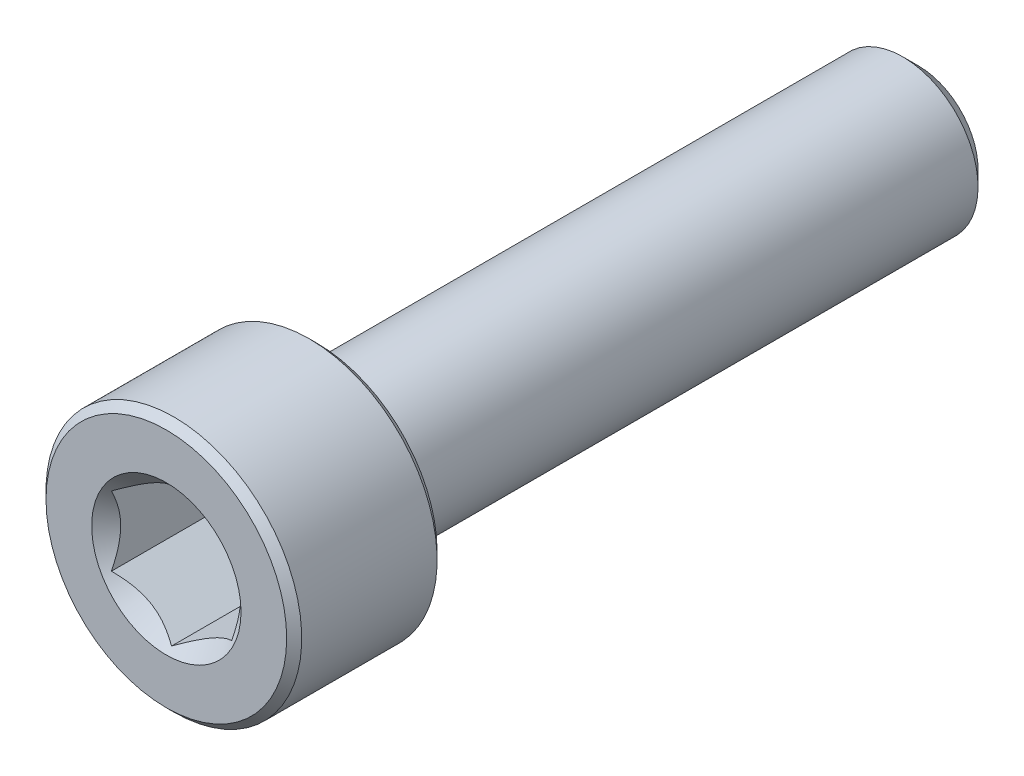
ISO-10303-21;
HEADER;
FILE_DESCRIPTION(('STEP AP214'),'2;1');
FILE_NAME('part.step','',(''),(''),'','','');
FILE_SCHEMA(('AUTOMOTIVE_DESIGN { 1 0 10303 214 1 1 1 1 }'));
ENDSEC;
DATA;
#1=APPLICATION_CONTEXT('core data for automotive mechanical design processes');
#2=APPLICATION_PROTOCOL_DEFINITION('international standard','automotive_design',2000,#1);
#3=PRODUCT_CONTEXT('',#1,'mechanical');
#4=PRODUCT('Part','Part','',(#3));
#5=PRODUCT_RELATED_PRODUCT_CATEGORY('part','',(#4));
#6=PRODUCT_DEFINITION_FORMATION('','',#4);
#7=PRODUCT_DEFINITION_CONTEXT('part definition',#1,'design');
#8=PRODUCT_DEFINITION('design','',#6,#7);
#9=PRODUCT_DEFINITION_SHAPE('','',#8);
#10=(LENGTH_UNIT() NAMED_UNIT(*) SI_UNIT(.MILLI.,.METRE.));
#11=(NAMED_UNIT(*) PLANE_ANGLE_UNIT() SI_UNIT($,.RADIAN.));
#12=(NAMED_UNIT(*) SI_UNIT($,.STERADIAN.) SOLID_ANGLE_UNIT());
#13=UNCERTAINTY_MEASURE_WITH_UNIT(LENGTH_MEASURE(1.E-05),#10,'distance_accuracy_value','');
#14=(GEOMETRIC_REPRESENTATION_CONTEXT(3) GLOBAL_UNCERTAINTY_ASSIGNED_CONTEXT((#13)) GLOBAL_UNIT_ASSIGNED_CONTEXT((#10,
#11,#12)) REPRESENTATION_CONTEXT('',''));
#15=CARTESIAN_POINT('',(0.,0.,0.));
#16=DIRECTION('',(0.,0.,1.));
#17=DIRECTION('',(1.,0.,0.));
#18=AXIS2_PLACEMENT_3D('',#15,#16,#17);
#19=CARTESIAN_POINT('',(0.,1.98038475772934,-12.5));
#20=DIRECTION('',(0.,0.,-1.));
#21=DIRECTION('',(0.,1.,0.));
#22=AXIS2_PLACEMENT_3D('',#19,#20,#21);
#23=PLANE('',#22);
#24=CARTESIAN_POINT('',(0.,0.,-12.5));
#25=DIRECTION('',(0.,0.,-1.));
#26=DIRECTION('',(0.,1.,0.));
#27=AXIS2_PLACEMENT_3D('',#24,#25,#26);
#28=CIRCLE('',#27,1.98038475772934);
#29=CARTESIAN_POINT('',(0.,1.98038475772934,-12.5));
#30=VERTEX_POINT('',#29);
#31=EDGE_CURVE('E55',#30,#30,#28,.T.);
#32=ORIENTED_EDGE('',*,*,#31,.T.);
#33=EDGE_LOOP('',(#32));
#34=FACE_BOUND('',#33,.T.);
#35=ADVANCED_FACE('F41',(#34),#23,.T.);
#36=CARTESIAN_POINT('',(0.,0.,-12.5));
#37=DIRECTION('',(0.,0.,1.));
#38=DIRECTION('',(0.,-1.,0.));
#39=AXIS2_PLACEMENT_3D('',#36,#37,#38);
#40=CONICAL_SURFACE('',#39,1.98038475772934,0.785398163397443);
#41=CARTESIAN_POINT('',(0.,0.,-11.9803847577293));
#42=DIRECTION('',(0.,0.,-1.));
#43=DIRECTION('',(0.,1.,0.));
#44=AXIS2_PLACEMENT_3D('',#41,#42,#43);
#45=CIRCLE('',#44,2.5);
#46=CARTESIAN_POINT('',(0.,2.5,-11.9803847577293));
#47=VERTEX_POINT('',#46);
#48=EDGE_CURVE('E173',#47,#47,#45,.T.);
#49=ORIENTED_EDGE('',*,*,#48,.T.);
#50=EDGE_LOOP('',(#49));
#51=FACE_BOUND('',#50,.T.);
#52=ORIENTED_EDGE('',*,*,#31,.F.);
#53=EDGE_LOOP('',(#52));
#54=FACE_BOUND('',#53,.T.);
#55=ADVANCED_FACE('F181',(#51,#54),#40,.T.);
#56=CARTESIAN_POINT('',(0.,0.,-12.5));
#57=DIRECTION('',(0.,0.,-1.));
#58=DIRECTION('',(0.,1.,0.));
#59=AXIS2_PLACEMENT_3D('',#56,#57,#58);
#60=CYLINDRICAL_SURFACE('',#59,2.5);
#61=CARTESIAN_POINT('',(0.,0.,7.25));
#62=DIRECTION('',(0.,0.,-1.));
#63=DIRECTION('',(0.,1.,0.));
#64=AXIS2_PLACEMENT_3D('',#61,#62,#63);
#65=CIRCLE('',#64,2.5);
#66=CARTESIAN_POINT('',(0.,2.5,7.25));
#67=VERTEX_POINT('',#66);
#68=EDGE_CURVE('E169',#67,#67,#65,.T.);
#69=ORIENTED_EDGE('',*,*,#68,.T.);
#70=EDGE_LOOP('',(#69));
#71=FACE_BOUND('',#70,.T.);
#72=ORIENTED_EDGE('',*,*,#48,.F.);
#73=EDGE_LOOP('',(#72));
#74=FACE_BOUND('',#73,.T.);
#75=ADVANCED_FACE('F183',(#71,#74),#60,.T.);
#76=CARTESIAN_POINT('',(0.,0.,7.25));
#77=DIRECTION('',(0.,0.,-1.));
#78=DIRECTION('',(0.,1.,0.));
#79=AXIS2_PLACEMENT_3D('',#76,#77,#78);
#80=TOROIDAL_SURFACE('',#79,2.75,0.25);
#81=CARTESIAN_POINT('',(0.,0.,7.5));
#82=DIRECTION('',(0.,0.,-1.));
#83=DIRECTION('',(0.,1.,0.));
#84=AXIS2_PLACEMENT_3D('',#81,#82,#83);
#85=CIRCLE('',#84,2.75);
#86=CARTESIAN_POINT('',(0.,2.75,7.5));
#87=VERTEX_POINT('',#86);
#88=EDGE_CURVE('E165',#87,#87,#85,.T.);
#89=ORIENTED_EDGE('',*,*,#88,.T.);
#90=EDGE_LOOP('',(#89));
#91=FACE_BOUND('',#90,.T.);
#92=ORIENTED_EDGE('',*,*,#68,.F.);
#93=EDGE_LOOP('',(#92));
#94=FACE_BOUND('',#93,.T.);
#95=ADVANCED_FACE('F189',(#91,#94),#80,.F.);
#96=CARTESIAN_POINT('',(0.,4.,7.5));
#97=DIRECTION('',(0.,0.,-1.));
#98=DIRECTION('',(0.,1.,0.));
#99=AXIS2_PLACEMENT_3D('',#96,#97,#98);
#100=PLANE('',#99);
#101=CARTESIAN_POINT('',(0.,0.,7.5));
#102=DIRECTION('',(0.,0.,-1.));
#103=DIRECTION('',(0.,1.,0.));
#104=AXIS2_PLACEMENT_3D('',#101,#102,#103);
#105=CIRCLE('',#104,4.);
#106=CARTESIAN_POINT('',(0.,4.,7.5));
#107=VERTEX_POINT('',#106);
#108=EDGE_CURVE('E161',#107,#107,#105,.T.);
#109=ORIENTED_EDGE('',*,*,#108,.T.);
#110=EDGE_LOOP('',(#109));
#111=FACE_BOUND('',#110,.T.);
#112=ORIENTED_EDGE('',*,*,#88,.F.);
#113=EDGE_LOOP('',(#112));
#114=FACE_BOUND('',#113,.T.);
#115=ADVANCED_FACE('F195',(#111,#114),#100,.T.);
#116=CARTESIAN_POINT('',(0.,0.,7.5));
#117=DIRECTION('',(0.,0.,1.));
#118=DIRECTION('',(0.,-1.,0.));
#119=AXIS2_PLACEMENT_3D('',#116,#117,#118);
#120=CONICAL_SURFACE('',#119,4.,0.785398163397448);
#121=CARTESIAN_POINT('',(0.,0.,7.75));
#122=DIRECTION('',(0.,0.,-1.));
#123=DIRECTION('',(0.,1.,0.));
#124=AXIS2_PLACEMENT_3D('',#121,#122,#123);
#125=CIRCLE('',#124,4.25);
#126=CARTESIAN_POINT('',(0.,4.25,7.75));
#127=VERTEX_POINT('',#126);
#128=EDGE_CURVE('E157',#127,#127,#125,.T.);
#129=ORIENTED_EDGE('',*,*,#128,.T.);
#130=EDGE_LOOP('',(#129));
#131=FACE_BOUND('',#130,.T.);
#132=ORIENTED_EDGE('',*,*,#108,.F.);
#133=EDGE_LOOP('',(#132));
#134=FACE_BOUND('',#133,.T.);
#135=ADVANCED_FACE('F199',(#131,#134),#120,.T.);
#136=CARTESIAN_POINT('',(0.,0.,-12.5));
#137=DIRECTION('',(0.,0.,-1.));
#138=DIRECTION('',(0.,1.,0.));
#139=AXIS2_PLACEMENT_3D('',#136,#137,#138);
#140=CYLINDRICAL_SURFACE('',#139,4.25);
#141=CARTESIAN_POINT('',(0.,0.,12.25));
#142=DIRECTION('',(0.,0.,-1.));
#143=DIRECTION('',(0.,1.,0.));
#144=AXIS2_PLACEMENT_3D('',#141,#142,#143);
#145=CIRCLE('',#144,4.25);
#146=CARTESIAN_POINT('',(0.,4.25,12.25));
#147=VERTEX_POINT('',#146);
#148=EDGE_CURVE('E153',#147,#147,#145,.T.);
#149=ORIENTED_EDGE('',*,*,#148,.T.);
#150=EDGE_LOOP('',(#149));
#151=FACE_BOUND('',#150,.T.);
#152=ORIENTED_EDGE('',*,*,#128,.F.);
#153=EDGE_LOOP('',(#152));
#154=FACE_BOUND('',#153,.T.);
#155=ADVANCED_FACE('F203',(#151,#154),#140,.T.);
#156=CARTESIAN_POINT('',(0.,0.,12.25));
#157=DIRECTION('',(0.,0.,-1.));
#158=DIRECTION('',(0.,1.,0.));
#159=AXIS2_PLACEMENT_3D('',#156,#157,#158);
#160=CONICAL_SURFACE('',#159,4.25,0.785398163397448);
#161=CARTESIAN_POINT('',(0.,0.,12.5));
#162=DIRECTION('',(0.,0.,-1.));
#163=DIRECTION('',(0.,1.,0.));
#164=AXIS2_PLACEMENT_3D('',#161,#162,#163);
#165=CIRCLE('',#164,4.);
#166=CARTESIAN_POINT('',(0.,4.,12.5));
#167=VERTEX_POINT('',#166);
#168=EDGE_CURVE('E149',#167,#167,#165,.T.);
#169=ORIENTED_EDGE('',*,*,#168,.T.);
#170=EDGE_LOOP('',(#169));
#171=FACE_BOUND('',#170,.T.);
#172=ORIENTED_EDGE('',*,*,#148,.F.);
#173=EDGE_LOOP('',(#172));
#174=FACE_BOUND('',#173,.T.);
#175=ADVANCED_FACE('F207',(#171,#174),#160,.T.);
#176=CARTESIAN_POINT('',(0.,0.,12.5));
#177=DIRECTION('',(0.,0.,1.));
#178=DIRECTION('',(0.,-1.,0.));
#179=AXIS2_PLACEMENT_3D('',#176,#177,#178);
#180=PLANE('',#179);
#181=CARTESIAN_POINT('',(0.,0.,12.5));
#182=DIRECTION('',(0.,0.,1.));
#183=DIRECTION('',(1.,0.,0.));
#184=AXIS2_PLACEMENT_3D('',#181,#182,#183);
#185=CIRCLE('',#184,2.48260615751539);
#186=CARTESIAN_POINT('',(2.48260615751539,0.,12.5));
#187=VERTEX_POINT('',#186);
#188=EDGE_CURVE('E115',#187,#187,#185,.T.);
#189=ORIENTED_EDGE('',*,*,#188,.F.);
#190=EDGE_LOOP('',(#189));
#191=FACE_BOUND('',#190,.T.);
#192=ORIENTED_EDGE('',*,*,#168,.F.);
#193=EDGE_LOOP('',(#192));
#194=FACE_BOUND('',#193,.T.);
#195=ADVANCED_FACE('F211',(#191,#194),#180,.T.);
#196=CARTESIAN_POINT('',(0.,0.,12.5));
#197=DIRECTION('',(0.,0.,1.));
#198=DIRECTION('',(1.,0.,0.));
#199=AXIS2_PLACEMENT_3D('',#196,#197,#198);
#200=CONICAL_SURFACE('',#199,2.48260615751539,0.78539816339745);
#201=ORIENTED_EDGE('',*,*,#188,.T.);
#202=EDGE_LOOP('',(#201));
#203=FACE_BOUND('',#202,.T.);
#204=CARTESIAN_POINT('',(-0.000199999999998729,-2.30951654681234,12.3269103979568));
#205=CARTESIAN_POINT('',(0.0685530340307069,-2.26982196410711,12.2872480094687));
#206=CARTESIAN_POINT('',(0.138455742135513,-2.22946361676572,12.2499149015273));
#207=CARTESIAN_POINT('',(0.280995244550438,-2.1471683966763,12.1815586043793));
#208=CARTESIAN_POINT('',(0.35364559756536,-2.10522369580642,12.1505734529803));
#209=CARTESIAN_POINT('',(0.500141601053973,-2.02064418875706,12.0974951357873));
#210=CARTESIAN_POINT('',(0.573949935246296,-1.97803092714269,12.0752685464197));
#211=CARTESIAN_POINT('',(0.723191631835266,-1.89186619344273,12.0410237359182));
#212=CARTESIAN_POINT('',(0.798620433918153,-1.84831735425552,12.0289799483872));
#213=CARTESIAN_POINT('',(0.92861550067108,-1.7732646674724,12.0181134311487));
#214=CARTESIAN_POINT('',(0.98301378397011,-1.74185780396625,12.0165046728531));
#215=CARTESIAN_POINT('',(1.09172145551969,-1.67909540053412,12.0192137968418));
#216=CARTESIAN_POINT('',(1.14603080592134,-1.64773988246021,12.0235337570011));
#217=CARTESIAN_POINT('',(1.25413672758934,-1.5853248994842,12.037854486653));
#218=CARTESIAN_POINT('',(1.30793265655479,-1.55426580541469,12.0478616120051));
#219=CARTESIAN_POINT('',(1.41459426230557,-1.49268469862228,12.0730073494928));
#220=CARTESIAN_POINT('',(1.46746001007071,-1.46216264491917,12.0881455682854));
#221=CARTESIAN_POINT('',(1.60287973308985,-1.38397803138049,12.1330894226723));
#222=CARTESIAN_POINT('',(1.68459383484948,-1.33680037273297,12.1662837586689));
#223=CARTESIAN_POINT('',(1.8047470372578,-1.26742988897853,12.2223207424145));
#224=CARTESIAN_POINT('',(1.84434285210918,-1.24456923461531,12.2420096221901));
#225=CARTESIAN_POINT('',(1.92280095888787,-1.19927142554652,12.283182237608));
#226=CARTESIAN_POINT('',(1.96166368359374,-1.17683402097614,12.3046648708944));
#227=CARTESIAN_POINT('',(2.0002,-1.15458506832541,12.3269103979568));
#228=B_SPLINE_CURVE_WITH_KNOTS('',3,(#204,#205,#206,#207,#208,#209,#210,#211,#212,#213,#214,
#215,#216,#217,#218,#219,#220,#221,#222,#223,#224,#225,#226,#227),.UNSPECIFIED.,.F.,.F.,(4,2,2,
2,2,2,2,2,2,2,2,4),(0.,0.266420613771064,0.534393751523389,0.798110374376915,1.06116288956936,
1.24939906803722,1.43770123566247,1.62621426093932,1.81471283831913,2.11415604834145,
2.2634717071779,2.41269626969771),.UNSPECIFIED.);
#229=CARTESIAN_POINT('',(0.,-2.3094010767585,12.3267949192431));
#230=VERTEX_POINT('',#229);
#231=CARTESIAN_POINT('',(2.,-1.15470053837925,12.3267949192431));
#232=VERTEX_POINT('',#231);
#233=EDGE_CURVE('E12',#230,#232,#228,.T.);
#234=ORIENTED_EDGE('',*,*,#233,.F.);
#235=CARTESIAN_POINT('',(-2.0002,-1.15458506832541,12.3269103979568));
#236=CARTESIAN_POINT('',(-1.93144696596929,-1.19427965103064,12.2872480094687));
#237=CARTESIAN_POINT('',(-1.86154425786449,-1.23463799837204,12.2499149015273));
#238=CARTESIAN_POINT('',(-1.71900475544956,-1.31693321846145,12.1815586043793));
#239=CARTESIAN_POINT('',(-1.64635440243464,-1.35887791933134,12.1505734529803));
#240=CARTESIAN_POINT('',(-1.49985839894603,-1.44345742638069,12.0974951357873));
#241=CARTESIAN_POINT('',(-1.42605006475371,-1.48607068799507,12.0752685464197));
#242=CARTESIAN_POINT('',(-1.27680836816474,-1.57223542169503,12.0410237359182));
#243=CARTESIAN_POINT('',(-1.20137956608185,-1.61578426088223,12.0289799483872));
#244=CARTESIAN_POINT('',(-1.07138449932892,-1.69083694766536,12.0181134311487));
#245=CARTESIAN_POINT('',(-1.01698621602989,-1.72224381117151,12.0165046728531));
#246=CARTESIAN_POINT('',(-0.908278544480306,-1.78500621460364,12.0192137968418));
#247=CARTESIAN_POINT('',(-0.85396919407866,-1.81636173267754,12.0235337570011));
#248=CARTESIAN_POINT('',(-0.745863272410661,-1.87877671565355,12.037854486653));
#249=CARTESIAN_POINT('',(-0.692067343445207,-1.90983580972306,12.0478616120051));
#250=CARTESIAN_POINT('',(-0.585405737694426,-1.97141691651547,12.0730073494928));
#251=CARTESIAN_POINT('',(-0.532539989929287,-2.00193897021859,12.0881455682854));
#252=CARTESIAN_POINT('',(-0.397120266910155,-2.08012358375727,12.1330894226723));
#253=CARTESIAN_POINT('',(-0.31540616515052,-2.12730124240478,12.1662837586689));
#254=CARTESIAN_POINT('',(-0.195252962742197,-2.19667172615922,12.2223207424145));
#255=CARTESIAN_POINT('',(-0.155657147890822,-2.21953238052245,12.2420096221901));
#256=CARTESIAN_POINT('',(-0.0771990411121273,-2.26483018959124,12.283182237608));
#257=CARTESIAN_POINT('',(-0.0383363164062589,-2.28726759416161,12.3046648708944));
#258=CARTESIAN_POINT('',(0.000200000000001219,-2.30951654681234,12.3269103979568));
#259=B_SPLINE_CURVE_WITH_KNOTS('',3,(#235,#236,#237,#238,#239,#240,#241,#242,#243,#244,#245,
#246,#247,#248,#249,#250,#251,#252,#253,#254,#255,#256,#257,#258),.UNSPECIFIED.,.F.,.F.,(4,2,2,
2,2,2,2,2,2,2,2,4),(0.,0.266420613771063,0.534393751523388,0.798110374376915,1.06116288956936,
1.24939906803722,1.43770123566248,1.62621426093932,1.81471283831913,2.11415604834145,
2.26347170717791,2.41269626969771),.UNSPECIFIED.);
#260=CARTESIAN_POINT('',(-2.,-1.15470053837925,12.3267949192431));
#261=VERTEX_POINT('',#260);
#262=EDGE_CURVE('E100',#261,#230,#259,.T.);
#263=ORIENTED_EDGE('',*,*,#262,.F.);
#264=CARTESIAN_POINT('',(-2.,-2.42398175579868,13.1599545105457));
#265=CARTESIAN_POINT('',(-2.,-2.3654738763041,13.1148351758713));
#266=CARTESIAN_POINT('',(-2.,-2.30665236661135,13.0701161756265));
#267=CARTESIAN_POINT('',(-2.,-2.18825331969084,12.9816622121418));
#268=CARTESIAN_POINT('',(-2.,-2.12867560822125,12.9379274823771));
#269=CARTESIAN_POINT('',(-2.,-2.00820019262835,12.8513142462896));
#270=CARTESIAN_POINT('',(-2.,-1.94729585350119,12.8084449389484));
#271=CARTESIAN_POINT('',(-2.,-1.82447635639412,12.7241846501668));
#272=CARTESIAN_POINT('',(-2.,-1.76256126823391,12.6827935672392));
#273=CARTESIAN_POINT('',(-2.,-1.63352305153315,12.5992199648467));
#274=CARTESIAN_POINT('',(-2.,-1.56632133333278,12.5571581799355));
#275=CARTESIAN_POINT('',(-2.,-1.43035896394453,12.4756383889365));
#276=CARTESIAN_POINT('',(-2.,-1.3615985170145,12.4361800443101));
#277=CARTESIAN_POINT('',(-2.,-1.22246684398892,12.3606863637627));
#278=CARTESIAN_POINT('',(-2.,-1.15210085009344,12.3246414605251));
#279=CARTESIAN_POINT('',(-2.,-1.00937086384545,12.2567889383446));
#280=CARTESIAN_POINT('',(-2.,-0.937007838648199,12.224979310286));
#281=CARTESIAN_POINT('',(-2.,-0.797532850709094,12.1696918996687));
#282=CARTESIAN_POINT('',(-2.,-0.730627867984568,12.1456972616385));
#283=CARTESIAN_POINT('',(-2.,-0.595101218410187,12.1030621374066));
#284=CARTESIAN_POINT('',(-2.,-0.526479443554563,12.0844219889886));
#285=CARTESIAN_POINT('',(-2.,-0.38913152845113,12.0538205255166));
#286=CARTESIAN_POINT('',(-2.,-0.320433088583212,12.0417369815865));
#287=CARTESIAN_POINT('',(-2.,-0.182167175628636,12.0245029259217));
#288=CARTESIAN_POINT('',(-2.,-0.112599890436882,12.0193509405131));
#289=CARTESIAN_POINT('',(-2.,0.0235742388197044,12.0164261236486));
#290=CARTESIAN_POINT('',(-2.,0.0901742622543221,12.0183334186349));
#291=CARTESIAN_POINT('',(-2.,0.222860647279179,12.0286844259992));
#292=CARTESIAN_POINT('',(-2.,0.288946962142557,12.037128726115));
#293=CARTESIAN_POINT('',(-2.,0.421249515605842,12.0602169544548));
#294=CARTESIAN_POINT('',(-2.,0.487446247340619,12.074970869731));
#295=CARTESIAN_POINT('',(-2.,0.61837553918038,12.1098579982816));
#296=CARTESIAN_POINT('',(-2.,0.683108176846778,12.1299909258717));
#297=CARTESIAN_POINT('',(-2.,0.881750195572361,12.199485149858));
#298=CARTESIAN_POINT('',(-2.,1.01295821830486,12.2565400033525));
#299=CARTESIAN_POINT('',(-2.,1.26925973679032,12.3835183967961));
#300=CARTESIAN_POINT('',(-2.,1.39432972284545,12.4534871660011));
#301=CARTESIAN_POINT('',(-2.,1.57512870977373,12.5627644548654));
#302=CARTESIAN_POINT('',(-2.,1.63281357796871,12.5989012241787));
#303=CARTESIAN_POINT('',(-2.,1.74719269140407,12.6727216099303));
#304=CARTESIAN_POINT('',(-2.,1.80388686201493,12.7104053421917));
#305=CARTESIAN_POINT('',(-2.,1.91595826038669,12.7867305219709));
#306=CARTESIAN_POINT('',(-2.,1.97134240267412,12.8253618677048));
#307=CARTESIAN_POINT('',(-2.,2.08135060816028,12.9036615543687));
#308=CARTESIAN_POINT('',(-2.,2.13597487670731,12.9433296064566));
#309=CARTESIAN_POINT('',(-2.,2.19028039622781,12.9834228737147));
#310=B_SPLINE_CURVE_WITH_KNOTS('',3,(#264,#265,#266,#267,#268,#269,#270,#271,#272,#273,#274,
#275,#276,#277,#278,#279,#280,#281,#282,#283,#284,#285,#286,#287,#288,#289,#290,#291,#292,#293,
#294,#295,#296,#297,#298,#299,#300,#301,#302,#303,#304,#305,#306,#307,#308,#309),.UNSPECIFIED.,
.F.,.F.,(4,2,2,2,2,2,2,2,2,2,2,2,2,2,2,2,2,2,2,2,2,2,4),(0.,0.221657667100339,0.443367370127324,
0.666786125723388,0.89018951294144,1.12798201434515,1.36574353320624,1.60281759521649,
1.83977879106023,2.05282811904838,2.26589088413717,2.47483185958036,2.68372840641278,
2.88327763021218,3.08284479743512,3.28604242448891,3.48922926167214,3.91721633282415,
4.34673183999753,4.55091998635568,4.75512344852471,4.95768958131487,5.16019986543559),.UNSPECIFIED.);
#311=CARTESIAN_POINT('',(-2.,1.15470053837925,12.3267949192431));
#312=VERTEX_POINT('',#311);
#313=EDGE_CURVE('E114',#312,#261,#310,.F.);
#314=ORIENTED_EDGE('',*,*,#313,.F.);
#315=CARTESIAN_POINT('',(0.000199999999999905,2.30951654681234,12.3269103979568));
#316=CARTESIAN_POINT('',(-0.0685530340307056,2.26982196410711,12.2872480094687));
#317=CARTESIAN_POINT('',(-0.138455742135512,2.22946361676572,12.2499149015273));
#318=CARTESIAN_POINT('',(-0.280995244550437,2.1471683966763,12.1815586043793));
#319=CARTESIAN_POINT('',(-0.353645597565359,2.10522369580642,12.1505734529803));
#320=CARTESIAN_POINT('',(-0.500141601053972,2.02064418875706,12.0974951357873));
#321=CARTESIAN_POINT('',(-0.573949935246295,1.97803092714269,12.0752685464197));
#322=CARTESIAN_POINT('',(-0.723191631835265,1.89186619344273,12.0410237359182));
#323=CARTESIAN_POINT('',(-0.798620433918153,1.84831735425552,12.0289799483872));
#324=CARTESIAN_POINT('',(-0.928615500671081,1.77326466747239,12.0181134311487));
#325=CARTESIAN_POINT('',(-0.983013783970111,1.74185780396625,12.0165046728531));
#326=CARTESIAN_POINT('',(-1.0917214555197,1.67909540053412,12.0192137968418));
#327=CARTESIAN_POINT('',(-1.14603080592134,1.64773988246021,12.0235337570011));
#328=CARTESIAN_POINT('',(-1.25413672758934,1.5853248994842,12.037854486653));
#329=CARTESIAN_POINT('',(-1.30793265655479,1.55426580541469,12.0478616120051));
#330=CARTESIAN_POINT('',(-1.41459426230558,1.49268469862228,12.0730073494928));
#331=CARTESIAN_POINT('',(-1.46746001007071,1.46216264491916,12.0881455682854));
#332=CARTESIAN_POINT('',(-1.60287973308985,1.38397803138048,12.1330894226723));
#333=CARTESIAN_POINT('',(-1.68459383484948,1.33680037273297,12.1662837586689));
#334=CARTESIAN_POINT('',(-1.8047470372578,1.26742988897853,12.2223207424145));
#335=CARTESIAN_POINT('',(-1.84434285210918,1.24456923461531,12.2420096221901));
#336=CARTESIAN_POINT('',(-1.92280095888787,1.19927142554652,12.283182237608));
#337=CARTESIAN_POINT('',(-1.96166368359374,1.17683402097614,12.3046648708944));
#338=CARTESIAN_POINT('',(-2.0002,1.15458506832541,12.3269103979568));
#339=B_SPLINE_CURVE_WITH_KNOTS('',3,(#315,#316,#317,#318,#319,#320,#321,#322,#323,#324,#325,
#326,#327,#328,#329,#330,#331,#332,#333,#334,#335,#336,#337,#338),.UNSPECIFIED.,.F.,.F.,(4,2,2,
2,2,2,2,2,2,2,2,4),(0.,0.266420613771065,0.534393751523389,0.798110374376915,1.06116288956937,
1.24939906803722,1.43770123566248,1.62621426093932,1.81471283831914,2.11415604834145,
2.2634717071779,2.41269626969771),.UNSPECIFIED.);
#340=CARTESIAN_POINT('',(0.,2.3094010767585,12.3267949192431));
#341=VERTEX_POINT('',#340);
#342=EDGE_CURVE('E262',#341,#312,#339,.T.);
#343=ORIENTED_EDGE('',*,*,#342,.F.);
#344=CARTESIAN_POINT('',(2.0002,1.15458506832541,12.3269103979568));
#345=CARTESIAN_POINT('',(1.93144696596929,1.19427965103064,12.2872480094687));
#346=CARTESIAN_POINT('',(1.86154425786449,1.23463799837204,12.2499149015273));
#347=CARTESIAN_POINT('',(1.71900475544956,1.31693321846145,12.1815586043793));
#348=CARTESIAN_POINT('',(1.64635440243464,1.35887791933134,12.1505734529803));
#349=CARTESIAN_POINT('',(1.49985839894603,1.44345742638069,12.0974951357873));
#350=CARTESIAN_POINT('',(1.4260500647537,1.48607068799507,12.0752685464197));
#351=CARTESIAN_POINT('',(1.27680836816473,1.57223542169503,12.0410237359182));
#352=CARTESIAN_POINT('',(1.20137956608185,1.61578426088223,12.0289799483872));
#353=CARTESIAN_POINT('',(1.07138449932892,1.69083694766536,12.0181134311487));
#354=CARTESIAN_POINT('',(1.01698621602989,1.72224381117151,12.0165046728531));
#355=CARTESIAN_POINT('',(0.908278544480304,1.78500621460364,12.0192137968418));
#356=CARTESIAN_POINT('',(0.853969194078659,1.81636173267754,12.0235337570011));
#357=CARTESIAN_POINT('',(0.745863272410659,1.87877671565355,12.037854486653));
#358=CARTESIAN_POINT('',(0.692067343445205,1.90983580972306,12.0478616120051));
#359=CARTESIAN_POINT('',(0.585405737694424,1.97141691651548,12.0730073494928));
#360=CARTESIAN_POINT('',(0.532539989929285,2.00193897021859,12.0881455682854));
#361=CARTESIAN_POINT('',(0.397120266910154,2.08012358375727,12.1330894226723));
#362=CARTESIAN_POINT('',(0.315406165150519,2.12730124240478,12.1662837586689));
#363=CARTESIAN_POINT('',(0.195252962742196,2.19667172615922,12.2223207424145));
#364=CARTESIAN_POINT('',(0.155657147890821,2.21953238052245,12.2420096221901));
#365=CARTESIAN_POINT('',(0.0771990411121271,2.26483018959124,12.283182237608));
#366=CARTESIAN_POINT('',(0.0383363164062595,2.28726759416161,12.3046648708944));
#367=CARTESIAN_POINT('',(-0.000199999999999916,2.30951654681234,12.3269103979568));
#368=B_SPLINE_CURVE_WITH_KNOTS('',3,(#344,#345,#346,#347,#348,#349,#350,#351,#352,#353,#354,
#355,#356,#357,#358,#359,#360,#361,#362,#363,#364,#365,#366,#367),.UNSPECIFIED.,.F.,.F.,(4,2,2,
2,2,2,2,2,2,2,2,4),(0.,0.266420613771065,0.534393751523391,0.798110374376916,1.06116288956937,
1.24939906803722,1.43770123566248,1.62621426093932,1.81471283831914,2.11415604834145,
2.26347170717791,2.41269626969771),.UNSPECIFIED.);
#369=CARTESIAN_POINT('',(2.,1.15470053837925,12.3267949192431));
#370=VERTEX_POINT('',#369);
#371=EDGE_CURVE('E235',#370,#341,#368,.T.);
#372=ORIENTED_EDGE('',*,*,#371,.F.);
#373=CARTESIAN_POINT('',(2.,-2.42398175579868,13.1599545105457));
#374=CARTESIAN_POINT('',(2.,-2.3654738763041,13.1148351758713));
#375=CARTESIAN_POINT('',(2.,-2.30665236661135,13.0701161756265));
#376=CARTESIAN_POINT('',(2.,-2.18825331969084,12.9816622121418));
#377=CARTESIAN_POINT('',(2.,-2.12867560822125,12.9379274823771));
#378=CARTESIAN_POINT('',(2.,-2.00820019262835,12.8513142462896));
#379=CARTESIAN_POINT('',(2.,-1.94729585350119,12.8084449389484));
#380=CARTESIAN_POINT('',(2.,-1.82447635639412,12.7241846501668));
#381=CARTESIAN_POINT('',(2.,-1.76256126823391,12.6827935672392));
#382=CARTESIAN_POINT('',(2.,-1.63352305153315,12.5992199648467));
#383=CARTESIAN_POINT('',(2.,-1.56632133333278,12.5571581799355));
#384=CARTESIAN_POINT('',(2.,-1.43035896394453,12.4756383889365));
#385=CARTESIAN_POINT('',(2.,-1.3615985170145,12.4361800443101));
#386=CARTESIAN_POINT('',(2.,-1.22246684398892,12.3606863637627));
#387=CARTESIAN_POINT('',(2.,-1.15210085009344,12.3246414605251));
#388=CARTESIAN_POINT('',(2.,-1.00937086384545,12.2567889383446));
#389=CARTESIAN_POINT('',(2.,-0.937007838648199,12.224979310286));
#390=CARTESIAN_POINT('',(2.,-0.797532850709094,12.1696918996687));
#391=CARTESIAN_POINT('',(2.,-0.730627867984568,12.1456972616385));
#392=CARTESIAN_POINT('',(2.,-0.595101218410187,12.1030621374066));
#393=CARTESIAN_POINT('',(2.,-0.526479443554562,12.0844219889886));
#394=CARTESIAN_POINT('',(2.,-0.38913152845113,12.0538205255166));
#395=CARTESIAN_POINT('',(2.,-0.320433088583212,12.0417369815865));
#396=CARTESIAN_POINT('',(2.,-0.182167175628636,12.0245029259217));
#397=CARTESIAN_POINT('',(2.,-0.112599890436882,12.0193509405131));
#398=CARTESIAN_POINT('',(2.,0.0235742388197047,12.0164261236486));
#399=CARTESIAN_POINT('',(2.,0.0901742622543226,12.0183334186349));
#400=CARTESIAN_POINT('',(2.,0.22286064727918,12.0286844259992));
#401=CARTESIAN_POINT('',(2.,0.288946962142558,12.037128726115));
#402=CARTESIAN_POINT('',(2.,0.421249515605843,12.0602169544548));
#403=CARTESIAN_POINT('',(2.,0.48744624734062,12.074970869731));
#404=CARTESIAN_POINT('',(2.,0.618375539180381,12.1098579982816));
#405=CARTESIAN_POINT('',(2.,0.683108176846779,12.1299909258717));
#406=CARTESIAN_POINT('',(2.,0.881750195572364,12.199485149858));
#407=CARTESIAN_POINT('',(2.,1.01295821830486,12.2565400033525));
#408=CARTESIAN_POINT('',(2.,1.26925973679032,12.3835183967961));
#409=CARTESIAN_POINT('',(2.,1.39432972284545,12.4534871660011));
#410=CARTESIAN_POINT('',(2.,1.57512870977373,12.5627644548654));
#411=CARTESIAN_POINT('',(2.,1.63281357796872,12.5989012241787));
#412=CARTESIAN_POINT('',(2.,1.74719269140407,12.6727216099303));
#413=CARTESIAN_POINT('',(2.,1.80388686201493,12.7104053421917));
#414=CARTESIAN_POINT('',(2.,1.91595826038669,12.7867305219709));
#415=CARTESIAN_POINT('',(2.,1.97134240267412,12.8253618677048));
#416=CARTESIAN_POINT('',(2.,2.08135060816028,12.9036615543687));
#417=CARTESIAN_POINT('',(2.,2.13597487670732,12.9433296064566));
#418=CARTESIAN_POINT('',(2.,2.19028039622782,12.9834228737147));
#419=B_SPLINE_CURVE_WITH_KNOTS('',3,(#373,#374,#375,#376,#377,#378,#379,#380,#381,#382,#383,
#384,#385,#386,#387,#388,#389,#390,#391,#392,#393,#394,#395,#396,#397,#398,#399,#400,#401,#402,
#403,#404,#405,#406,#407,#408,#409,#410,#411,#412,#413,#414,#415,#416,#417,#418),.UNSPECIFIED.,
.F.,.F.,(4,2,2,2,2,2,2,2,2,2,2,2,2,2,2,2,2,2,2,2,2,2,4),(0.,0.221657667100339,0.443367370127324,
0.666786125723385,0.890189512941438,1.12798201434515,1.36574353320623,1.60281759521649,
1.83977879106023,2.05282811904838,2.26589088413717,2.47483185958036,2.68372840641278,
2.88327763021218,3.08284479743512,3.28604242448891,3.48922926167214,3.91721633282416,
4.34673183999753,4.55091998635568,4.75512344852471,4.95768958131487,5.1601998654356),.UNSPECIFIED.);
#420=EDGE_CURVE('E62',#232,#370,#419,.T.);
#421=ORIENTED_EDGE('',*,*,#420,.F.);
#422=EDGE_LOOP('',(#234,#263,#314,#343,#372,#421));
#423=FACE_BOUND('',#422,.T.);
#424=ADVANCED_FACE('F99',(#203,#423),#200,.F.);
#425=CARTESIAN_POINT('',(0.,4.,8.5));
#426=DIRECTION('',(0.,0.,-1.));
#427=DIRECTION('',(0.,1.,0.));
#428=AXIS2_PLACEMENT_3D('',#425,#426,#427);
#429=PLANE('',#428);
#430=DIRECTION('',(0.866025403784439,0.5,0.));
#431=VECTOR('',#430,1.);
#432=CARTESIAN_POINT('',(0.,-2.3094010767585,8.5));
#433=LINE('',#432,#431);
#434=CARTESIAN_POINT('',(0.,-2.3094010767585,8.5));
#435=VERTEX_POINT('',#434);
#436=CARTESIAN_POINT('',(2.,-1.15470053837925,8.5));
#437=VERTEX_POINT('',#436);
#438=EDGE_CURVE('E118',#435,#437,#433,.T.);
#439=ORIENTED_EDGE('',*,*,#438,.T.);
#440=DIRECTION('',(0.,1.,0.));
#441=VECTOR('',#440,1.);
#442=CARTESIAN_POINT('',(2.,-1.15470053837925,8.5));
#443=LINE('',#442,#441);
#444=CARTESIAN_POINT('',(2.,1.15470053837925,8.5));
#445=VERTEX_POINT('',#444);
#446=EDGE_CURVE('E69',#437,#445,#443,.T.);
#447=ORIENTED_EDGE('',*,*,#446,.T.);
#448=DIRECTION('',(-0.866025403784439,0.5,0.));
#449=VECTOR('',#448,1.);
#450=CARTESIAN_POINT('',(2.,1.15470053837925,8.5));
#451=LINE('',#450,#449);
#452=CARTESIAN_POINT('',(0.,2.3094010767585,8.5));
#453=VERTEX_POINT('',#452);
#454=EDGE_CURVE('E129',#445,#453,#451,.T.);
#455=ORIENTED_EDGE('',*,*,#454,.T.);
#456=DIRECTION('',(-0.866025403784438,-0.5,0.));
#457=VECTOR('',#456,1.);
#458=CARTESIAN_POINT('',(0.,2.3094010767585,8.5));
#459=LINE('',#458,#457);
#460=CARTESIAN_POINT('',(-2.,1.15470053837925,8.5));
#461=VERTEX_POINT('',#460);
#462=EDGE_CURVE('E138',#453,#461,#459,.T.);
#463=ORIENTED_EDGE('',*,*,#462,.T.);
#464=DIRECTION('',(0.,-1.,0.));
#465=VECTOR('',#464,1.);
#466=CARTESIAN_POINT('',(-2.,1.15470053837925,8.5));
#467=LINE('',#466,#465);
#468=CARTESIAN_POINT('',(-2.,-1.15470053837925,8.5));
#469=VERTEX_POINT('',#468);
#470=EDGE_CURVE('E133',#461,#469,#467,.T.);
#471=ORIENTED_EDGE('',*,*,#470,.T.);
#472=DIRECTION('',(0.866025403784439,-0.5,0.));
#473=VECTOR('',#472,1.);
#474=CARTESIAN_POINT('',(-2.,-1.15470053837925,8.5));
#475=LINE('',#474,#473);
#476=EDGE_CURVE('E120',#469,#435,#475,.T.);
#477=ORIENTED_EDGE('',*,*,#476,.T.);
#478=EDGE_LOOP('',(#439,#447,#455,#463,#471,#477));
#479=FACE_BOUND('',#478,.T.);
#480=ADVANCED_FACE('F216',(#479),#429,.F.);
#481=CARTESIAN_POINT('',(0.,-2.3094010767585,1.38989907339221));
#482=DIRECTION('',(0.5,-0.866025403784438,0.));
#483=DIRECTION('',(0.866025403784439,0.5,0.));
#484=AXIS2_PLACEMENT_3D('',#481,#482,#483);
#485=PLANE('',#484);
#486=DIRECTION('',(0.,0.,1.));
#487=VECTOR('',#486,1.);
#488=CARTESIAN_POINT('',(0.,-2.3094010767585,1.38989907339221));
#489=LINE('',#488,#487);
#490=EDGE_CURVE('E109',#435,#230,#489,.T.);
#491=ORIENTED_EDGE('',*,*,#490,.T.);
#492=ORIENTED_EDGE('',*,*,#233,.T.);
#493=DIRECTION('',(0.,0.,1.));
#494=VECTOR('',#493,1.);
#495=CARTESIAN_POINT('',(2.,-1.15470053837925,1.38989907339221));
#496=LINE('',#495,#494);
#497=EDGE_CURVE('E124',#437,#232,#496,.T.);
#498=ORIENTED_EDGE('',*,*,#497,.F.);
#499=ORIENTED_EDGE('',*,*,#438,.F.);
#500=EDGE_LOOP('',(#491,#492,#498,#499));
#501=FACE_BOUND('',#500,.T.);
#502=ADVANCED_FACE('F117',(#501),#485,.F.);
#503=CARTESIAN_POINT('',(-2.,-1.15470053837925,1.38989907339221));
#504=DIRECTION('',(-0.5,-0.866025403784438,0.));
#505=DIRECTION('',(0.866025403784439,-0.5,0.));
#506=AXIS2_PLACEMENT_3D('',#503,#504,#505);
#507=PLANE('',#506);
#508=DIRECTION('',(0.,0.,1.));
#509=VECTOR('',#508,1.);
#510=CARTESIAN_POINT('',(-2.,-1.15470053837925,1.38989907339221));
#511=LINE('',#510,#509);
#512=EDGE_CURVE('E112',#469,#261,#511,.T.);
#513=ORIENTED_EDGE('',*,*,#512,.T.);
#514=ORIENTED_EDGE('',*,*,#262,.T.);
#515=ORIENTED_EDGE('',*,*,#490,.F.);
#516=ORIENTED_EDGE('',*,*,#476,.F.);
#517=EDGE_LOOP('',(#513,#514,#515,#516));
#518=FACE_BOUND('',#517,.T.);
#519=ADVANCED_FACE('F108',(#518),#507,.F.);
#520=CARTESIAN_POINT('',(-2.,1.15470053837925,1.38989907339221));
#521=DIRECTION('',(-1.,0.,0.));
#522=DIRECTION('',(0.,0.,1.));
#523=AXIS2_PLACEMENT_3D('',#520,#521,#522);
#524=PLANE('',#523);
#525=DIRECTION('',(0.,0.,1.));
#526=VECTOR('',#525,1.);
#527=CARTESIAN_POINT('',(-2.,1.15470053837925,1.38989907339221));
#528=LINE('',#527,#526);
#529=EDGE_CURVE('E134',#461,#312,#528,.T.);
#530=ORIENTED_EDGE('',*,*,#529,.T.);
#531=ORIENTED_EDGE('',*,*,#313,.T.);
#532=ORIENTED_EDGE('',*,*,#512,.F.);
#533=ORIENTED_EDGE('',*,*,#470,.F.);
#534=EDGE_LOOP('',(#530,#531,#532,#533));
#535=FACE_BOUND('',#534,.T.);
#536=ADVANCED_FACE('F272',(#535),#524,.F.);
#537=CARTESIAN_POINT('',(0.,2.3094010767585,1.38989907339221));
#538=DIRECTION('',(-0.5,0.866025403784438,0.));
#539=DIRECTION('',(-0.866025403784438,-0.5,0.));
#540=AXIS2_PLACEMENT_3D('',#537,#538,#539);
#541=PLANE('',#540);
#542=DIRECTION('',(0.,0.,1.));
#543=VECTOR('',#542,1.);
#544=CARTESIAN_POINT('',(0.,2.3094010767585,1.38989907339221));
#545=LINE('',#544,#543);
#546=EDGE_CURVE('E139',#453,#341,#545,.T.);
#547=ORIENTED_EDGE('',*,*,#546,.T.);
#548=ORIENTED_EDGE('',*,*,#342,.T.);
#549=ORIENTED_EDGE('',*,*,#529,.F.);
#550=ORIENTED_EDGE('',*,*,#462,.F.);
#551=EDGE_LOOP('',(#547,#548,#549,#550));
#552=FACE_BOUND('',#551,.T.);
#553=ADVANCED_FACE('F269',(#552),#541,.F.);
#554=CARTESIAN_POINT('',(2.,1.15470053837925,1.38989907339221));
#555=DIRECTION('',(0.5,0.866025403784439,0.));
#556=DIRECTION('',(-0.866025403784439,0.5,0.));
#557=AXIS2_PLACEMENT_3D('',#554,#555,#556);
#558=PLANE('',#557);
#559=DIRECTION('',(0.,0.,1.));
#560=VECTOR('',#559,1.);
#561=CARTESIAN_POINT('',(2.,1.15470053837925,1.38989907339221));
#562=LINE('',#561,#560);
#563=EDGE_CURVE('E143',#445,#370,#562,.T.);
#564=ORIENTED_EDGE('',*,*,#563,.T.);
#565=ORIENTED_EDGE('',*,*,#371,.T.);
#566=ORIENTED_EDGE('',*,*,#546,.F.);
#567=ORIENTED_EDGE('',*,*,#454,.F.);
#568=EDGE_LOOP('',(#564,#565,#566,#567));
#569=FACE_BOUND('',#568,.T.);
#570=ADVANCED_FACE('F224',(#569),#558,.F.);
#571=CARTESIAN_POINT('',(2.,-1.15470053837925,1.38989907339221));
#572=DIRECTION('',(1.,0.,0.));
#573=DIRECTION('',(0.,0.,-1.));
#574=AXIS2_PLACEMENT_3D('',#571,#572,#573);
#575=PLANE('',#574);
#576=ORIENTED_EDGE('',*,*,#497,.T.);
#577=ORIENTED_EDGE('',*,*,#420,.T.);
#578=ORIENTED_EDGE('',*,*,#563,.F.);
#579=ORIENTED_EDGE('',*,*,#446,.F.);
#580=EDGE_LOOP('',(#576,#577,#578,#579));
#581=FACE_BOUND('',#580,.T.);
#582=ADVANCED_FACE('F220',(#581),#575,.F.);
#583=CLOSED_SHELL('',(#35,#55,#75,#95,#115,#135,#155,#175,#195,#424,#480,#502,#519,#536,#553,
#570,#582));
#584=MANIFOLD_SOLID_BREP('B2',#583);
#585=ADVANCED_BREP_SHAPE_REPRESENTATION('',(#18,#584),#14);
#586=SHAPE_DEFINITION_REPRESENTATION(#9,#585);
ENDSEC;
END-ISO-10303-21;
